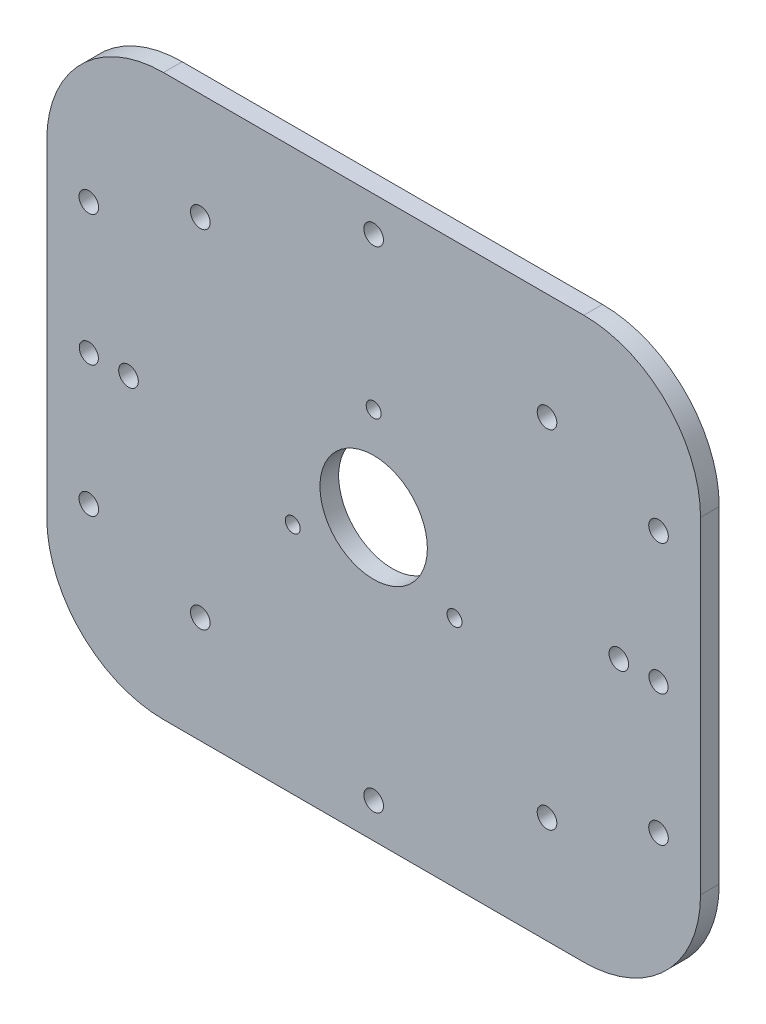
ISO-10303-21;
HEADER;
FILE_DESCRIPTION(('STEP AP214'),'2;1');
FILE_NAME('part.step','',(''),(''),'','','');
FILE_SCHEMA(('AUTOMOTIVE_DESIGN { 1 0 10303 214 1 1 1 1 }'));
ENDSEC;
DATA;
#1=APPLICATION_CONTEXT('core data for automotive mechanical design processes');
#2=APPLICATION_PROTOCOL_DEFINITION('international standard','automotive_design',2000,#1);
#3=PRODUCT_CONTEXT('',#1,'mechanical');
#4=PRODUCT('Part','Part','',(#3));
#5=PRODUCT_RELATED_PRODUCT_CATEGORY('part','',(#4));
#6=PRODUCT_DEFINITION_FORMATION('','',#4);
#7=PRODUCT_DEFINITION_CONTEXT('part definition',#1,'design');
#8=PRODUCT_DEFINITION('design','',#6,#7);
#9=PRODUCT_DEFINITION_SHAPE('','',#8);
#10=(LENGTH_UNIT() NAMED_UNIT(*) SI_UNIT(.MILLI.,.METRE.));
#11=(NAMED_UNIT(*) PLANE_ANGLE_UNIT() SI_UNIT($,.RADIAN.));
#12=(NAMED_UNIT(*) SI_UNIT($,.STERADIAN.) SOLID_ANGLE_UNIT());
#13=UNCERTAINTY_MEASURE_WITH_UNIT(LENGTH_MEASURE(1.E-05),#10,'distance_accuracy_value','');
#14=(GEOMETRIC_REPRESENTATION_CONTEXT(3) GLOBAL_UNCERTAINTY_ASSIGNED_CONTEXT((#13)) GLOBAL_UNIT_ASSIGNED_CONTEXT((#10,
#11,#12)) REPRESENTATION_CONTEXT('',''));
#15=CARTESIAN_POINT('',(0.,0.,0.));
#16=DIRECTION('',(0.,0.,1.));
#17=DIRECTION('',(1.,0.,0.));
#18=AXIS2_PLACEMENT_3D('',#15,#16,#17);
#19=CARTESIAN_POINT('',(0.,0.,4.));
#20=DIRECTION('',(0.,0.,-1.));
#21=DIRECTION('',(-1.,0.,0.));
#22=AXIS2_PLACEMENT_3D('',#19,#20,#21);
#23=PLANE('',#22);
#24=CARTESIAN_POINT('',(70.,80.,4.));
#25=DIRECTION('',(0.,0.,1.));
#26=DIRECTION('',(1.,0.,0.));
#27=AXIS2_PLACEMENT_3D('',#24,#25,#26);
#28=CIRCLE('',#27,1.60000000000001);
#29=CARTESIAN_POINT('',(71.6,80.,4.));
#30=VERTEX_POINT('',#29);
#31=EDGE_CURVE('E216',#30,#30,#28,.T.);
#32=ORIENTED_EDGE('',*,*,#31,.F.);
#33=EDGE_LOOP('',(#32));
#34=FACE_BOUND('',#33,.T.);
#35=CARTESIAN_POINT('',(87.3205080756896,50.0000000000004,4.));
#36=DIRECTION('',(0.,0.,1.));
#37=DIRECTION('',(1.,0.,0.));
#38=AXIS2_PLACEMENT_3D('',#35,#36,#37);
#39=CIRCLE('',#38,1.6);
#40=CARTESIAN_POINT('',(88.9205080756896,50.0000000000004,4.));
#41=VERTEX_POINT('',#40);
#42=EDGE_CURVE('E362',#41,#41,#39,.T.);
#43=ORIENTED_EDGE('',*,*,#42,.F.);
#44=EDGE_LOOP('',(#43));
#45=FACE_BOUND('',#44,.T.);
#46=CARTESIAN_POINT('',(52.679491924312,49.9999999999997,4.));
#47=DIRECTION('',(0.,0.,1.));
#48=DIRECTION('',(1.,0.,0.));
#49=AXIS2_PLACEMENT_3D('',#46,#47,#48);
#50=CIRCLE('',#49,1.60000000000001);
#51=CARTESIAN_POINT('',(54.279491924312,49.9999999999997,4.));
#52=VERTEX_POINT('',#51);
#53=EDGE_CURVE('E365',#52,#52,#50,.T.);
#54=ORIENTED_EDGE('',*,*,#53,.F.);
#55=EDGE_LOOP('',(#54));
#56=FACE_BOUND('',#55,.T.);
#57=CARTESIAN_POINT('',(70.,112.5,4.));
#58=DIRECTION('',(0.,0.,1.));
#59=DIRECTION('',(1.,0.,0.));
#60=AXIS2_PLACEMENT_3D('',#57,#58,#59);
#61=CIRCLE('',#60,2.1);
#62=CARTESIAN_POINT('',(72.1,112.5,4.));
#63=VERTEX_POINT('',#62);
#64=EDGE_CURVE('E192',#63,#63,#61,.T.);
#65=ORIENTED_EDGE('',*,*,#64,.F.);
#66=EDGE_LOOP('',(#65));
#67=FACE_BOUND('',#66,.T.);
#68=CARTESIAN_POINT('',(107.123106012294,97.1231060122937,4.));
#69=DIRECTION('',(0.,0.,1.));
#70=DIRECTION('',(1.,0.,0.));
#71=AXIS2_PLACEMENT_3D('',#68,#69,#70);
#72=CIRCLE('',#71,2.1);
#73=CARTESIAN_POINT('',(109.223106012294,97.1231060122937,4.));
#74=VERTEX_POINT('',#73);
#75=EDGE_CURVE('E372',#74,#74,#72,.T.);
#76=ORIENTED_EDGE('',*,*,#75,.F.);
#77=EDGE_LOOP('',(#76));
#78=FACE_BOUND('',#77,.T.);
#79=CARTESIAN_POINT('',(122.5,60.,4.));
#80=DIRECTION('',(0.,0.,1.));
#81=DIRECTION('',(1.,0.,0.));
#82=AXIS2_PLACEMENT_3D('',#79,#80,#81);
#83=CIRCLE('',#82,2.10000000000002);
#84=CARTESIAN_POINT('',(124.6,60.,4.));
#85=VERTEX_POINT('',#84);
#86=EDGE_CURVE('E375',#85,#85,#83,.T.);
#87=ORIENTED_EDGE('',*,*,#86,.F.);
#88=EDGE_LOOP('',(#87));
#89=FACE_BOUND('',#88,.T.);
#90=CARTESIAN_POINT('',(107.123106012294,22.8768939877063,4.));
#91=DIRECTION('',(0.,0.,1.));
#92=DIRECTION('',(1.,0.,0.));
#93=AXIS2_PLACEMENT_3D('',#90,#91,#92);
#94=CIRCLE('',#93,2.10000000000002);
#95=CARTESIAN_POINT('',(109.223106012294,22.8768939877063,4.));
#96=VERTEX_POINT('',#95);
#97=EDGE_CURVE('E378',#96,#96,#94,.T.);
#98=ORIENTED_EDGE('',*,*,#97,.F.);
#99=EDGE_LOOP('',(#98));
#100=FACE_BOUND('',#99,.T.);
#101=CARTESIAN_POINT('',(70.,7.50000000000001,4.));
#102=DIRECTION('',(0.,0.,1.));
#103=DIRECTION('',(1.,0.,0.));
#104=AXIS2_PLACEMENT_3D('',#101,#102,#103);
#105=CIRCLE('',#104,2.10000000000002);
#106=CARTESIAN_POINT('',(72.1,7.50000000000001,4.));
#107=VERTEX_POINT('',#106);
#108=EDGE_CURVE('E381',#107,#107,#105,.T.);
#109=ORIENTED_EDGE('',*,*,#108,.F.);
#110=EDGE_LOOP('',(#109));
#111=FACE_BOUND('',#110,.T.);
#112=CARTESIAN_POINT('',(32.8768939877063,22.8768939877062,4.));
#113=DIRECTION('',(0.,0.,1.));
#114=DIRECTION('',(1.,0.,0.));
#115=AXIS2_PLACEMENT_3D('',#112,#113,#114);
#116=CIRCLE('',#115,2.1);
#117=CARTESIAN_POINT('',(34.9768939877063,22.8768939877062,4.));
#118=VERTEX_POINT('',#117);
#119=EDGE_CURVE('E230',#118,#118,#116,.T.);
#120=ORIENTED_EDGE('',*,*,#119,.F.);
#121=EDGE_LOOP('',(#120));
#122=FACE_BOUND('',#121,.T.);
#123=CARTESIAN_POINT('',(17.5,60.,4.));
#124=DIRECTION('',(0.,0.,1.));
#125=DIRECTION('',(1.,0.,0.));
#126=AXIS2_PLACEMENT_3D('',#123,#124,#125);
#127=CIRCLE('',#126,2.10000000000001);
#128=CARTESIAN_POINT('',(19.6,60.,4.));
#129=VERTEX_POINT('',#128);
#130=EDGE_CURVE('E225',#129,#129,#127,.T.);
#131=ORIENTED_EDGE('',*,*,#130,.F.);
#132=EDGE_LOOP('',(#131));
#133=FACE_BOUND('',#132,.T.);
#134=CARTESIAN_POINT('',(32.8768939877063,97.1231060122937,4.));
#135=DIRECTION('',(0.,0.,1.));
#136=DIRECTION('',(1.,0.,0.));
#137=AXIS2_PLACEMENT_3D('',#134,#135,#136);
#138=CIRCLE('',#137,2.09999999999999);
#139=CARTESIAN_POINT('',(34.9768939877063,97.1231060122937,4.));
#140=VERTEX_POINT('',#139);
#141=EDGE_CURVE('E221',#140,#140,#138,.T.);
#142=ORIENTED_EDGE('',*,*,#141,.F.);
#143=EDGE_LOOP('',(#142));
#144=FACE_BOUND('',#143,.T.);
#145=CARTESIAN_POINT('',(131.,32.,4.));
#146=DIRECTION('',(0.,0.,1.));
#147=DIRECTION('',(-1.,0.,0.));
#148=AXIS2_PLACEMENT_3D('',#145,#146,#147);
#149=CIRCLE('',#148,2.1);
#150=CARTESIAN_POINT('',(128.9,32.,4.));
#151=VERTEX_POINT('',#150);
#152=EDGE_CURVE('E166',#151,#151,#149,.T.);
#153=ORIENTED_EDGE('',*,*,#152,.F.);
#154=EDGE_LOOP('',(#153));
#155=FACE_BOUND('',#154,.T.);
#156=CARTESIAN_POINT('',(131.,60.,4.));
#157=DIRECTION('',(0.,0.,-1.));
#158=DIRECTION('',(-1.,0.,0.));
#159=AXIS2_PLACEMENT_3D('',#156,#157,#158);
#160=CIRCLE('',#159,2.05);
#161=CARTESIAN_POINT('',(128.95,60.,4.));
#162=VERTEX_POINT('',#161);
#163=EDGE_CURVE('E159',#162,#162,#160,.T.);
#164=ORIENTED_EDGE('',*,*,#163,.T.);
#165=EDGE_LOOP('',(#164));
#166=FACE_BOUND('',#165,.T.);
#167=CARTESIAN_POINT('',(131.,88.,4.));
#168=DIRECTION('',(0.,0.,-1.));
#169=DIRECTION('',(-1.,0.,0.));
#170=AXIS2_PLACEMENT_3D('',#167,#168,#169);
#171=CIRCLE('',#170,2.1);
#172=CARTESIAN_POINT('',(128.9,88.,4.));
#173=VERTEX_POINT('',#172);
#174=EDGE_CURVE('E165',#173,#173,#171,.T.);
#175=ORIENTED_EDGE('',*,*,#174,.T.);
#176=EDGE_LOOP('',(#175));
#177=FACE_BOUND('',#176,.T.);
#178=CARTESIAN_POINT('',(9.00000000000001,32.,4.));
#179=DIRECTION('',(0.,0.,-1.));
#180=DIRECTION('',(1.,0.,0.));
#181=AXIS2_PLACEMENT_3D('',#178,#179,#180);
#182=CIRCLE('',#181,2.1);
#183=CARTESIAN_POINT('',(11.1,32.,4.));
#184=VERTEX_POINT('',#183);
#185=EDGE_CURVE('E154',#184,#184,#182,.T.);
#186=ORIENTED_EDGE('',*,*,#185,.T.);
#187=EDGE_LOOP('',(#186));
#188=FACE_BOUND('',#187,.T.);
#189=CARTESIAN_POINT('',(9.00000000000001,60.,4.));
#190=DIRECTION('',(0.,0.,1.));
#191=DIRECTION('',(1.,0.,0.));
#192=AXIS2_PLACEMENT_3D('',#189,#190,#191);
#193=CIRCLE('',#192,2.05);
#194=CARTESIAN_POINT('',(11.05,60.,4.));
#195=VERTEX_POINT('',#194);
#196=EDGE_CURVE('E146',#195,#195,#193,.T.);
#197=ORIENTED_EDGE('',*,*,#196,.F.);
#198=EDGE_LOOP('',(#197));
#199=FACE_BOUND('',#198,.T.);
#200=CARTESIAN_POINT('',(9.00000000000001,88.,4.));
#201=DIRECTION('',(0.,0.,1.));
#202=DIRECTION('',(1.,0.,0.));
#203=AXIS2_PLACEMENT_3D('',#200,#201,#202);
#204=CIRCLE('',#203,2.1);
#205=CARTESIAN_POINT('',(11.1,88.,4.));
#206=VERTEX_POINT('',#205);
#207=EDGE_CURVE('E153',#206,#206,#204,.T.);
#208=ORIENTED_EDGE('',*,*,#207,.F.);
#209=EDGE_LOOP('',(#208));
#210=FACE_BOUND('',#209,.T.);
#211=DIRECTION('',(0.,1.,0.));
#212=VECTOR('',#211,1.);
#213=CARTESIAN_POINT('',(140.,0.,4.));
#214=LINE('',#213,#212);
#215=CARTESIAN_POINT('',(140.,25.,4.));
#216=VERTEX_POINT('',#215);
#217=CARTESIAN_POINT('',(140.,95.,4.));
#218=VERTEX_POINT('',#217);
#219=EDGE_CURVE('E253',#216,#218,#214,.T.);
#220=ORIENTED_EDGE('',*,*,#219,.T.);
#221=CARTESIAN_POINT('',(115.,95.,4.));
#222=DIRECTION('',(0.,0.,-1.));
#223=DIRECTION('',(-1.,0.,0.));
#224=AXIS2_PLACEMENT_3D('',#221,#222,#223);
#225=CIRCLE('',#224,25.);
#226=CARTESIAN_POINT('',(115.,120.,4.));
#227=VERTEX_POINT('',#226);
#228=EDGE_CURVE('E180',#218,#227,#225,.F.);
#229=ORIENTED_EDGE('',*,*,#228,.T.);
#230=DIRECTION('',(-1.,0.,0.));
#231=VECTOR('',#230,1.);
#232=CARTESIAN_POINT('',(0.,120.,4.));
#233=LINE('',#232,#231);
#234=CARTESIAN_POINT('',(25.,120.,4.));
#235=VERTEX_POINT('',#234);
#236=EDGE_CURVE('E126',#227,#235,#233,.T.);
#237=ORIENTED_EDGE('',*,*,#236,.T.);
#238=CARTESIAN_POINT('',(25.,95.,4.));
#239=DIRECTION('',(0.,0.,-1.));
#240=DIRECTION('',(-1.,0.,0.));
#241=AXIS2_PLACEMENT_3D('',#238,#239,#240);
#242=CIRCLE('',#241,25.);
#243=CARTESIAN_POINT('',(0.,95.,4.));
#244=VERTEX_POINT('',#243);
#245=EDGE_CURVE('E175',#235,#244,#242,.F.);
#246=ORIENTED_EDGE('',*,*,#245,.T.);
#247=DIRECTION('',(0.,-1.,0.));
#248=VECTOR('',#247,1.);
#249=CARTESIAN_POINT('',(0.,0.,4.));
#250=LINE('',#249,#248);
#251=CARTESIAN_POINT('',(0.,25.,4.));
#252=VERTEX_POINT('',#251);
#253=EDGE_CURVE('E133',#244,#252,#250,.T.);
#254=ORIENTED_EDGE('',*,*,#253,.T.);
#255=CARTESIAN_POINT('',(25.,25.,4.));
#256=DIRECTION('',(0.,0.,-1.));
#257=DIRECTION('',(-1.,0.,0.));
#258=AXIS2_PLACEMENT_3D('',#255,#256,#257);
#259=CIRCLE('',#258,25.);
#260=CARTESIAN_POINT('',(25.,0.,4.));
#261=VERTEX_POINT('',#260);
#262=EDGE_CURVE('E62',#252,#261,#259,.F.);
#263=ORIENTED_EDGE('',*,*,#262,.T.);
#264=DIRECTION('',(1.,0.,0.));
#265=VECTOR('',#264,1.);
#266=CARTESIAN_POINT('',(0.,0.,4.));
#267=LINE('',#266,#265);
#268=CARTESIAN_POINT('',(115.,0.,4.));
#269=VERTEX_POINT('',#268);
#270=EDGE_CURVE('E136',#261,#269,#267,.T.);
#271=ORIENTED_EDGE('',*,*,#270,.T.);
#272=CARTESIAN_POINT('',(115.,25.,4.));
#273=DIRECTION('',(0.,0.,-1.));
#274=DIRECTION('',(-1.,0.,0.));
#275=AXIS2_PLACEMENT_3D('',#272,#273,#274);
#276=CIRCLE('',#275,25.);
#277=EDGE_CURVE('E178',#269,#216,#276,.F.);
#278=ORIENTED_EDGE('',*,*,#277,.T.);
#279=EDGE_LOOP('',(#220,#229,#237,#246,#254,#263,#271,#278));
#280=FACE_BOUND('',#279,.T.);
#281=CARTESIAN_POINT('',(70.,60.,4.));
#282=DIRECTION('',(0.,0.,1.));
#283=DIRECTION('',(1.,0.,0.));
#284=AXIS2_PLACEMENT_3D('',#281,#282,#283);
#285=CIRCLE('',#284,11.5);
#286=CARTESIAN_POINT('',(81.5,60.,4.));
#287=VERTEX_POINT('',#286);
#288=EDGE_CURVE('E246',#287,#287,#285,.T.);
#289=ORIENTED_EDGE('',*,*,#288,.F.);
#290=EDGE_LOOP('',(#289));
#291=FACE_BOUND('',#290,.T.);
#292=ADVANCED_FACE('F38',(#34,#45,#56,#67,#78,#89,#100,#111,#122,#133,#144,#155,#166,#177,#188,
#199,#210,#280,#291),#23,.F.);
#293=CARTESIAN_POINT('',(0.,0.,0.));
#294=DIRECTION('',(0.,0.,-1.));
#295=DIRECTION('',(-1.,0.,0.));
#296=AXIS2_PLACEMENT_3D('',#293,#294,#295);
#297=PLANE('',#296);
#298=CARTESIAN_POINT('',(70.,80.,0.));
#299=DIRECTION('',(0.,0.,-1.));
#300=DIRECTION('',(-1.,0.,0.));
#301=AXIS2_PLACEMENT_3D('',#298,#299,#300);
#302=CIRCLE('',#301,1.60000000000001);
#303=CARTESIAN_POINT('',(68.4,80.,0.));
#304=VERTEX_POINT('',#303);
#305=EDGE_CURVE('E42',#304,#304,#302,.T.);
#306=ORIENTED_EDGE('',*,*,#305,.F.);
#307=EDGE_LOOP('',(#306));
#308=FACE_BOUND('',#307,.T.);
#309=CARTESIAN_POINT('',(87.3205080756896,50.0000000000004,0.));
#310=DIRECTION('',(0.,0.,-1.));
#311=DIRECTION('',(-1.,0.,0.));
#312=AXIS2_PLACEMENT_3D('',#309,#310,#311);
#313=CIRCLE('',#312,1.6);
#314=CARTESIAN_POINT('',(85.7205080756896,50.0000000000004,0.));
#315=VERTEX_POINT('',#314);
#316=EDGE_CURVE('E215',#315,#315,#313,.T.);
#317=ORIENTED_EDGE('',*,*,#316,.F.);
#318=EDGE_LOOP('',(#317));
#319=FACE_BOUND('',#318,.T.);
#320=CARTESIAN_POINT('',(52.679491924312,49.9999999999997,0.));
#321=DIRECTION('',(0.,0.,-1.));
#322=DIRECTION('',(-1.,0.,0.));
#323=AXIS2_PLACEMENT_3D('',#320,#321,#322);
#324=CIRCLE('',#323,1.60000000000001);
#325=CARTESIAN_POINT('',(51.079491924312,49.9999999999997,0.));
#326=VERTEX_POINT('',#325);
#327=EDGE_CURVE('E213',#326,#326,#324,.T.);
#328=ORIENTED_EDGE('',*,*,#327,.F.);
#329=EDGE_LOOP('',(#328));
#330=FACE_BOUND('',#329,.T.);
#331=CARTESIAN_POINT('',(70.,112.5,0.));
#332=DIRECTION('',(0.,0.,-1.));
#333=DIRECTION('',(-1.,0.,0.));
#334=AXIS2_PLACEMENT_3D('',#331,#332,#333);
#335=CIRCLE('',#334,2.1);
#336=CARTESIAN_POINT('',(67.9,112.5,0.));
#337=VERTEX_POINT('',#336);
#338=EDGE_CURVE('E210',#337,#337,#335,.T.);
#339=ORIENTED_EDGE('',*,*,#338,.F.);
#340=EDGE_LOOP('',(#339));
#341=FACE_BOUND('',#340,.T.);
#342=CARTESIAN_POINT('',(107.123106012294,97.1231060122937,0.));
#343=DIRECTION('',(0.,0.,-1.));
#344=DIRECTION('',(-1.,0.,0.));
#345=AXIS2_PLACEMENT_3D('',#342,#343,#344);
#346=CIRCLE('',#345,2.1);
#347=CARTESIAN_POINT('',(105.023106012294,97.1231060122937,0.));
#348=VERTEX_POINT('',#347);
#349=EDGE_CURVE('E207',#348,#348,#346,.T.);
#350=ORIENTED_EDGE('',*,*,#349,.F.);
#351=EDGE_LOOP('',(#350));
#352=FACE_BOUND('',#351,.T.);
#353=CARTESIAN_POINT('',(122.5,60.,0.));
#354=DIRECTION('',(0.,0.,-1.));
#355=DIRECTION('',(-1.,0.,0.));
#356=AXIS2_PLACEMENT_3D('',#353,#354,#355);
#357=CIRCLE('',#356,2.10000000000002);
#358=CARTESIAN_POINT('',(120.4,60.,0.));
#359=VERTEX_POINT('',#358);
#360=EDGE_CURVE('E204',#359,#359,#357,.T.);
#361=ORIENTED_EDGE('',*,*,#360,.F.);
#362=EDGE_LOOP('',(#361));
#363=FACE_BOUND('',#362,.T.);
#364=CARTESIAN_POINT('',(107.123106012294,22.8768939877063,0.));
#365=DIRECTION('',(0.,0.,-1.));
#366=DIRECTION('',(-1.,0.,0.));
#367=AXIS2_PLACEMENT_3D('',#364,#365,#366);
#368=CIRCLE('',#367,2.10000000000002);
#369=CARTESIAN_POINT('',(105.023106012294,22.8768939877063,0.));
#370=VERTEX_POINT('',#369);
#371=EDGE_CURVE('E201',#370,#370,#368,.T.);
#372=ORIENTED_EDGE('',*,*,#371,.F.);
#373=EDGE_LOOP('',(#372));
#374=FACE_BOUND('',#373,.T.);
#375=CARTESIAN_POINT('',(70.,7.50000000000001,0.));
#376=DIRECTION('',(0.,0.,-1.));
#377=DIRECTION('',(-1.,0.,0.));
#378=AXIS2_PLACEMENT_3D('',#375,#376,#377);
#379=CIRCLE('',#378,2.10000000000002);
#380=CARTESIAN_POINT('',(67.9,7.50000000000001,0.));
#381=VERTEX_POINT('',#380);
#382=EDGE_CURVE('E198',#381,#381,#379,.T.);
#383=ORIENTED_EDGE('',*,*,#382,.F.);
#384=EDGE_LOOP('',(#383));
#385=FACE_BOUND('',#384,.T.);
#386=CARTESIAN_POINT('',(32.8768939877063,22.8768939877062,0.));
#387=DIRECTION('',(0.,0.,-1.));
#388=DIRECTION('',(-1.,0.,0.));
#389=AXIS2_PLACEMENT_3D('',#386,#387,#388);
#390=CIRCLE('',#389,2.1);
#391=CARTESIAN_POINT('',(30.7768939877063,22.8768939877062,0.));
#392=VERTEX_POINT('',#391);
#393=EDGE_CURVE('E195',#392,#392,#390,.T.);
#394=ORIENTED_EDGE('',*,*,#393,.F.);
#395=EDGE_LOOP('',(#394));
#396=FACE_BOUND('',#395,.T.);
#397=CARTESIAN_POINT('',(17.5,60.,0.));
#398=DIRECTION('',(0.,0.,-1.));
#399=DIRECTION('',(-1.,0.,0.));
#400=AXIS2_PLACEMENT_3D('',#397,#398,#399);
#401=CIRCLE('',#400,2.10000000000001);
#402=CARTESIAN_POINT('',(15.4,60.,0.));
#403=VERTEX_POINT('',#402);
#404=EDGE_CURVE('E191',#403,#403,#401,.T.);
#405=ORIENTED_EDGE('',*,*,#404,.F.);
#406=EDGE_LOOP('',(#405));
#407=FACE_BOUND('',#406,.T.);
#408=CARTESIAN_POINT('',(32.8768939877063,97.1231060122937,0.));
#409=DIRECTION('',(0.,0.,-1.));
#410=DIRECTION('',(-1.,0.,0.));
#411=AXIS2_PLACEMENT_3D('',#408,#409,#410);
#412=CIRCLE('',#411,2.09999999999999);
#413=CARTESIAN_POINT('',(30.7768939877063,97.1231060122937,0.));
#414=VERTEX_POINT('',#413);
#415=EDGE_CURVE('E188',#414,#414,#412,.T.);
#416=ORIENTED_EDGE('',*,*,#415,.F.);
#417=EDGE_LOOP('',(#416));
#418=FACE_BOUND('',#417,.T.);
#419=CARTESIAN_POINT('',(131.,32.,0.));
#420=DIRECTION('',(0.,0.,-1.));
#421=DIRECTION('',(-1.,0.,0.));
#422=AXIS2_PLACEMENT_3D('',#419,#420,#421);
#423=CIRCLE('',#422,2.1);
#424=CARTESIAN_POINT('',(128.9,32.,0.));
#425=VERTEX_POINT('',#424);
#426=EDGE_CURVE('E162',#425,#425,#423,.T.);
#427=ORIENTED_EDGE('',*,*,#426,.F.);
#428=EDGE_LOOP('',(#427));
#429=FACE_BOUND('',#428,.T.);
#430=CARTESIAN_POINT('',(131.,60.,0.));
#431=DIRECTION('',(0.,0.,-1.));
#432=DIRECTION('',(-1.,0.,0.));
#433=AXIS2_PLACEMENT_3D('',#430,#431,#432);
#434=CIRCLE('',#433,2.05);
#435=CARTESIAN_POINT('',(128.95,60.,0.));
#436=VERTEX_POINT('',#435);
#437=EDGE_CURVE('E158',#436,#436,#434,.F.);
#438=ORIENTED_EDGE('',*,*,#437,.T.);
#439=EDGE_LOOP('',(#438));
#440=FACE_BOUND('',#439,.T.);
#441=CARTESIAN_POINT('',(131.,88.,0.));
#442=DIRECTION('',(0.,0.,-1.));
#443=DIRECTION('',(-1.,0.,0.));
#444=AXIS2_PLACEMENT_3D('',#441,#442,#443);
#445=CIRCLE('',#444,2.1);
#446=CARTESIAN_POINT('',(128.9,88.,0.));
#447=VERTEX_POINT('',#446);
#448=EDGE_CURVE('E155',#447,#447,#445,.F.);
#449=ORIENTED_EDGE('',*,*,#448,.T.);
#450=EDGE_LOOP('',(#449));
#451=FACE_BOUND('',#450,.T.);
#452=CARTESIAN_POINT('',(9.00000000000001,32.,0.));
#453=DIRECTION('',(0.,0.,-1.));
#454=DIRECTION('',(-1.,0.,0.));
#455=AXIS2_PLACEMENT_3D('',#452,#453,#454);
#456=CIRCLE('',#455,2.1);
#457=CARTESIAN_POINT('',(6.90000000000001,32.,0.));
#458=VERTEX_POINT('',#457);
#459=EDGE_CURVE('E150',#458,#458,#456,.F.);
#460=ORIENTED_EDGE('',*,*,#459,.T.);
#461=EDGE_LOOP('',(#460));
#462=FACE_BOUND('',#461,.T.);
#463=CARTESIAN_POINT('',(9.00000000000001,60.,0.));
#464=DIRECTION('',(0.,0.,-1.));
#465=DIRECTION('',(-1.,0.,0.));
#466=AXIS2_PLACEMENT_3D('',#463,#464,#465);
#467=CIRCLE('',#466,2.05);
#468=CARTESIAN_POINT('',(6.95000000000001,60.,0.));
#469=VERTEX_POINT('',#468);
#470=EDGE_CURVE('E145',#469,#469,#467,.T.);
#471=ORIENTED_EDGE('',*,*,#470,.F.);
#472=EDGE_LOOP('',(#471));
#473=FACE_BOUND('',#472,.T.);
#474=CARTESIAN_POINT('',(9.00000000000001,88.,0.));
#475=DIRECTION('',(0.,0.,-1.));
#476=DIRECTION('',(-1.,0.,0.));
#477=AXIS2_PLACEMENT_3D('',#474,#475,#476);
#478=CIRCLE('',#477,2.1);
#479=CARTESIAN_POINT('',(6.90000000000001,88.,0.));
#480=VERTEX_POINT('',#479);
#481=EDGE_CURVE('E142',#480,#480,#478,.T.);
#482=ORIENTED_EDGE('',*,*,#481,.F.);
#483=EDGE_LOOP('',(#482));
#484=FACE_BOUND('',#483,.T.);
#485=DIRECTION('',(-1.,0.,0.));
#486=VECTOR('',#485,1.);
#487=CARTESIAN_POINT('',(0.,120.,0.));
#488=LINE('',#487,#486);
#489=CARTESIAN_POINT('',(115.,120.,0.));
#490=VERTEX_POINT('',#489);
#491=CARTESIAN_POINT('',(25.,120.,0.));
#492=VERTEX_POINT('',#491);
#493=EDGE_CURVE('E123',#490,#492,#488,.T.);
#494=ORIENTED_EDGE('',*,*,#493,.F.);
#495=CARTESIAN_POINT('',(115.,95.,0.));
#496=DIRECTION('',(0.,0.,-1.));
#497=DIRECTION('',(-1.,0.,0.));
#498=AXIS2_PLACEMENT_3D('',#495,#496,#497);
#499=CIRCLE('',#498,25.);
#500=CARTESIAN_POINT('',(140.,95.,0.));
#501=VERTEX_POINT('',#500);
#502=EDGE_CURVE('E106',#490,#501,#499,.T.);
#503=ORIENTED_EDGE('',*,*,#502,.T.);
#504=DIRECTION('',(0.,1.,0.));
#505=VECTOR('',#504,1.);
#506=CARTESIAN_POINT('',(140.,0.,0.));
#507=LINE('',#506,#505);
#508=CARTESIAN_POINT('',(140.,25.,0.));
#509=VERTEX_POINT('',#508);
#510=EDGE_CURVE('E134',#509,#501,#507,.T.);
#511=ORIENTED_EDGE('',*,*,#510,.F.);
#512=CARTESIAN_POINT('',(115.,25.,0.));
#513=DIRECTION('',(0.,0.,-1.));
#514=DIRECTION('',(-1.,0.,0.));
#515=AXIS2_PLACEMENT_3D('',#512,#513,#514);
#516=CIRCLE('',#515,25.);
#517=CARTESIAN_POINT('',(115.,0.,0.));
#518=VERTEX_POINT('',#517);
#519=EDGE_CURVE('E117',#509,#518,#516,.T.);
#520=ORIENTED_EDGE('',*,*,#519,.T.);
#521=DIRECTION('',(1.,0.,0.));
#522=VECTOR('',#521,1.);
#523=CARTESIAN_POINT('',(0.,0.,0.));
#524=LINE('',#523,#522);
#525=CARTESIAN_POINT('',(25.,0.,0.));
#526=VERTEX_POINT('',#525);
#527=EDGE_CURVE('E138',#526,#518,#524,.T.);
#528=ORIENTED_EDGE('',*,*,#527,.F.);
#529=CARTESIAN_POINT('',(25.,25.,0.));
#530=DIRECTION('',(0.,0.,-1.));
#531=DIRECTION('',(-1.,0.,0.));
#532=AXIS2_PLACEMENT_3D('',#529,#530,#531);
#533=CIRCLE('',#532,25.);
#534=CARTESIAN_POINT('',(0.,25.,0.));
#535=VERTEX_POINT('',#534);
#536=EDGE_CURVE('E169',#526,#535,#533,.T.);
#537=ORIENTED_EDGE('',*,*,#536,.T.);
#538=DIRECTION('',(0.,-1.,0.));
#539=VECTOR('',#538,1.);
#540=CARTESIAN_POINT('',(0.,0.,0.));
#541=LINE('',#540,#539);
#542=CARTESIAN_POINT('',(0.,95.,0.));
#543=VERTEX_POINT('',#542);
#544=EDGE_CURVE('E249',#543,#535,#541,.T.);
#545=ORIENTED_EDGE('',*,*,#544,.F.);
#546=CARTESIAN_POINT('',(25.,95.,0.));
#547=DIRECTION('',(0.,0.,-1.));
#548=DIRECTION('',(-1.,0.,0.));
#549=AXIS2_PLACEMENT_3D('',#546,#547,#548);
#550=CIRCLE('',#549,25.);
#551=EDGE_CURVE('E127',#543,#492,#550,.T.);
#552=ORIENTED_EDGE('',*,*,#551,.T.);
#553=EDGE_LOOP('',(#494,#503,#511,#520,#528,#537,#545,#552));
#554=FACE_BOUND('',#553,.T.);
#555=CARTESIAN_POINT('',(70.,60.,0.));
#556=DIRECTION('',(0.,0.,1.));
#557=DIRECTION('',(1.,0.,0.));
#558=AXIS2_PLACEMENT_3D('',#555,#556,#557);
#559=CIRCLE('',#558,11.5);
#560=CARTESIAN_POINT('',(81.5,60.,0.));
#561=VERTEX_POINT('',#560);
#562=EDGE_CURVE('E149',#561,#561,#559,.T.);
#563=ORIENTED_EDGE('',*,*,#562,.T.);
#564=EDGE_LOOP('',(#563));
#565=FACE_BOUND('',#564,.T.);
#566=ADVANCED_FACE('F130',(#308,#319,#330,#341,#352,#363,#374,#385,#396,#407,#418,#429,#440,
#451,#462,#473,#484,#554,#565),#297,.T.);
#567=CARTESIAN_POINT('',(0.,0.,4.));
#568=DIRECTION('',(1.,0.,0.));
#569=DIRECTION('',(0.,0.,-1.));
#570=AXIS2_PLACEMENT_3D('',#567,#568,#569);
#571=PLANE('',#570);
#572=ORIENTED_EDGE('',*,*,#544,.T.);
#573=DIRECTION('',(0.,0.,-1.));
#574=VECTOR('',#573,1.);
#575=CARTESIAN_POINT('',(0.,25.,4.));
#576=LINE('',#575,#574);
#577=EDGE_CURVE('E11',#535,#252,#576,.F.);
#578=ORIENTED_EDGE('',*,*,#577,.T.);
#579=ORIENTED_EDGE('',*,*,#253,.F.);
#580=DIRECTION('',(0.,0.,-1.));
#581=VECTOR('',#580,1.);
#582=CARTESIAN_POINT('',(0.,95.,4.));
#583=LINE('',#582,#581);
#584=EDGE_CURVE('E47',#244,#543,#583,.T.);
#585=ORIENTED_EDGE('',*,*,#584,.T.);
#586=EDGE_LOOP('',(#572,#578,#579,#585));
#587=FACE_BOUND('',#586,.T.);
#588=ADVANCED_FACE('F277',(#587),#571,.F.);
#589=CARTESIAN_POINT('',(0.,0.,4.));
#590=DIRECTION('',(0.,1.,0.));
#591=DIRECTION('',(0.,0.,1.));
#592=AXIS2_PLACEMENT_3D('',#589,#590,#591);
#593=PLANE('',#592);
#594=ORIENTED_EDGE('',*,*,#527,.T.);
#595=DIRECTION('',(0.,0.,-1.));
#596=VECTOR('',#595,1.);
#597=CARTESIAN_POINT('',(115.,0.,4.));
#598=LINE('',#597,#596);
#599=EDGE_CURVE('E55',#518,#269,#598,.F.);
#600=ORIENTED_EDGE('',*,*,#599,.T.);
#601=ORIENTED_EDGE('',*,*,#270,.F.);
#602=DIRECTION('',(0.,0.,-1.));
#603=VECTOR('',#602,1.);
#604=CARTESIAN_POINT('',(25.,0.,4.));
#605=LINE('',#604,#603);
#606=EDGE_CURVE('E182',#261,#526,#605,.T.);
#607=ORIENTED_EDGE('',*,*,#606,.T.);
#608=EDGE_LOOP('',(#594,#600,#601,#607));
#609=FACE_BOUND('',#608,.T.);
#610=ADVANCED_FACE('F259',(#609),#593,.F.);
#611=CARTESIAN_POINT('',(140.,0.,4.));
#612=DIRECTION('',(-1.,0.,0.));
#613=DIRECTION('',(0.,0.,1.));
#614=AXIS2_PLACEMENT_3D('',#611,#612,#613);
#615=PLANE('',#614);
#616=ORIENTED_EDGE('',*,*,#510,.T.);
#617=DIRECTION('',(0.,0.,-1.));
#618=VECTOR('',#617,1.);
#619=CARTESIAN_POINT('',(140.,95.,4.));
#620=LINE('',#619,#618);
#621=EDGE_CURVE('E111',#501,#218,#620,.F.);
#622=ORIENTED_EDGE('',*,*,#621,.T.);
#623=ORIENTED_EDGE('',*,*,#219,.F.);
#624=DIRECTION('',(0.,0.,-1.));
#625=VECTOR('',#624,1.);
#626=CARTESIAN_POINT('',(140.,25.,4.));
#627=LINE('',#626,#625);
#628=EDGE_CURVE('E116',#216,#509,#627,.T.);
#629=ORIENTED_EDGE('',*,*,#628,.T.);
#630=EDGE_LOOP('',(#616,#622,#623,#629));
#631=FACE_BOUND('',#630,.T.);
#632=ADVANCED_FACE('F268',(#631),#615,.F.);
#633=CARTESIAN_POINT('',(0.,120.,4.));
#634=DIRECTION('',(0.,-1.,0.));
#635=DIRECTION('',(0.,0.,-1.));
#636=AXIS2_PLACEMENT_3D('',#633,#634,#635);
#637=PLANE('',#636);
#638=ORIENTED_EDGE('',*,*,#236,.F.);
#639=DIRECTION('',(0.,0.,-1.));
#640=VECTOR('',#639,1.);
#641=CARTESIAN_POINT('',(115.,120.,4.));
#642=LINE('',#641,#640);
#643=EDGE_CURVE('E110',#227,#490,#642,.T.);
#644=ORIENTED_EDGE('',*,*,#643,.T.);
#645=ORIENTED_EDGE('',*,*,#493,.T.);
#646=DIRECTION('',(0.,0.,-1.));
#647=VECTOR('',#646,1.);
#648=CARTESIAN_POINT('',(25.,120.,4.));
#649=LINE('',#648,#647);
#650=EDGE_CURVE('E128',#492,#235,#649,.F.);
#651=ORIENTED_EDGE('',*,*,#650,.T.);
#652=EDGE_LOOP('',(#638,#644,#645,#651));
#653=FACE_BOUND('',#652,.T.);
#654=ADVANCED_FACE('F122',(#653),#637,.F.);
#655=CARTESIAN_POINT('',(70.,60.,4.));
#656=DIRECTION('',(0.,0.,-1.));
#657=DIRECTION('',(-1.,0.,0.));
#658=AXIS2_PLACEMENT_3D('',#655,#656,#657);
#659=CYLINDRICAL_SURFACE('',#658,11.5);
#660=ORIENTED_EDGE('',*,*,#288,.T.);
#661=EDGE_LOOP('',(#660));
#662=FACE_BOUND('',#661,.T.);
#663=ORIENTED_EDGE('',*,*,#562,.F.);
#664=EDGE_LOOP('',(#663));
#665=FACE_BOUND('',#664,.T.);
#666=ADVANCED_FACE('F275',(#662,#665),#659,.F.);
#667=CARTESIAN_POINT('',(9.00000000000001,88.,-6.));
#668=DIRECTION('',(0.,0.,1.));
#669=DIRECTION('',(1.,0.,0.));
#670=AXIS2_PLACEMENT_3D('',#667,#668,#669);
#671=CYLINDRICAL_SURFACE('',#670,2.1);
#672=ORIENTED_EDGE('',*,*,#481,.T.);
#673=EDGE_LOOP('',(#672));
#674=FACE_BOUND('',#673,.T.);
#675=ORIENTED_EDGE('',*,*,#207,.T.);
#676=EDGE_LOOP('',(#675));
#677=FACE_BOUND('',#676,.T.);
#678=ADVANCED_FACE('F292',(#674,#677),#671,.F.);
#679=CARTESIAN_POINT('',(9.00000000000001,60.,-6.));
#680=DIRECTION('',(0.,0.,1.));
#681=DIRECTION('',(1.,0.,0.));
#682=AXIS2_PLACEMENT_3D('',#679,#680,#681);
#683=CYLINDRICAL_SURFACE('',#682,2.05);
#684=ORIENTED_EDGE('',*,*,#470,.T.);
#685=EDGE_LOOP('',(#684));
#686=FACE_BOUND('',#685,.T.);
#687=ORIENTED_EDGE('',*,*,#196,.T.);
#688=EDGE_LOOP('',(#687));
#689=FACE_BOUND('',#688,.T.);
#690=ADVANCED_FACE('F296',(#686,#689),#683,.F.);
#691=CARTESIAN_POINT('',(9.00000000000001,32.,-6.));
#692=DIRECTION('',(0.,0.,1.));
#693=DIRECTION('',(1.,0.,0.));
#694=AXIS2_PLACEMENT_3D('',#691,#692,#693);
#695=CYLINDRICAL_SURFACE('',#694,2.1);
#696=ORIENTED_EDGE('',*,*,#459,.F.);
#697=EDGE_LOOP('',(#696));
#698=FACE_BOUND('',#697,.T.);
#699=ORIENTED_EDGE('',*,*,#185,.F.);
#700=EDGE_LOOP('',(#699));
#701=FACE_BOUND('',#700,.T.);
#702=ADVANCED_FACE('F300',(#698,#701),#695,.F.);
#703=CARTESIAN_POINT('',(131.,88.,-6.));
#704=DIRECTION('',(0.,0.,1.));
#705=DIRECTION('',(1.,0.,0.));
#706=AXIS2_PLACEMENT_3D('',#703,#704,#705);
#707=CYLINDRICAL_SURFACE('',#706,2.1);
#708=ORIENTED_EDGE('',*,*,#448,.F.);
#709=EDGE_LOOP('',(#708));
#710=FACE_BOUND('',#709,.T.);
#711=ORIENTED_EDGE('',*,*,#174,.F.);
#712=EDGE_LOOP('',(#711));
#713=FACE_BOUND('',#712,.T.);
#714=ADVANCED_FACE('F304',(#710,#713),#707,.F.);
#715=CARTESIAN_POINT('',(131.,60.,-6.));
#716=DIRECTION('',(0.,0.,1.));
#717=DIRECTION('',(1.,0.,0.));
#718=AXIS2_PLACEMENT_3D('',#715,#716,#717);
#719=CYLINDRICAL_SURFACE('',#718,2.05);
#720=ORIENTED_EDGE('',*,*,#437,.F.);
#721=EDGE_LOOP('',(#720));
#722=FACE_BOUND('',#721,.T.);
#723=ORIENTED_EDGE('',*,*,#163,.F.);
#724=EDGE_LOOP('',(#723));
#725=FACE_BOUND('',#724,.T.);
#726=ADVANCED_FACE('F308',(#722,#725),#719,.F.);
#727=CARTESIAN_POINT('',(131.,32.,-6.));
#728=DIRECTION('',(0.,0.,1.));
#729=DIRECTION('',(1.,0.,0.));
#730=AXIS2_PLACEMENT_3D('',#727,#728,#729);
#731=CYLINDRICAL_SURFACE('',#730,2.1);
#732=ORIENTED_EDGE('',*,*,#426,.T.);
#733=EDGE_LOOP('',(#732));
#734=FACE_BOUND('',#733,.T.);
#735=ORIENTED_EDGE('',*,*,#152,.T.);
#736=EDGE_LOOP('',(#735));
#737=FACE_BOUND('',#736,.T.);
#738=ADVANCED_FACE('F312',(#734,#737),#731,.F.);
#739=CARTESIAN_POINT('',(115.,95.,4.));
#740=DIRECTION('',(0.,0.,-1.));
#741=DIRECTION('',(-1.,0.,0.));
#742=AXIS2_PLACEMENT_3D('',#739,#740,#741);
#743=CYLINDRICAL_SURFACE('',#742,25.);
#744=ORIENTED_EDGE('',*,*,#228,.F.);
#745=ORIENTED_EDGE('',*,*,#621,.F.);
#746=ORIENTED_EDGE('',*,*,#502,.F.);
#747=ORIENTED_EDGE('',*,*,#643,.F.);
#748=EDGE_LOOP('',(#744,#745,#746,#747));
#749=FACE_BOUND('',#748,.T.);
#750=ADVANCED_FACE('F109',(#749),#743,.T.);
#751=CARTESIAN_POINT('',(115.,25.,4.));
#752=DIRECTION('',(0.,0.,-1.));
#753=DIRECTION('',(-1.,0.,0.));
#754=AXIS2_PLACEMENT_3D('',#751,#752,#753);
#755=CYLINDRICAL_SURFACE('',#754,25.);
#756=ORIENTED_EDGE('',*,*,#277,.F.);
#757=ORIENTED_EDGE('',*,*,#599,.F.);
#758=ORIENTED_EDGE('',*,*,#519,.F.);
#759=ORIENTED_EDGE('',*,*,#628,.F.);
#760=EDGE_LOOP('',(#756,#757,#758,#759));
#761=FACE_BOUND('',#760,.T.);
#762=ADVANCED_FACE('F263',(#761),#755,.T.);
#763=CARTESIAN_POINT('',(25.,25.,4.));
#764=DIRECTION('',(0.,0.,-1.));
#765=DIRECTION('',(-1.,0.,0.));
#766=AXIS2_PLACEMENT_3D('',#763,#764,#765);
#767=CYLINDRICAL_SURFACE('',#766,25.);
#768=ORIENTED_EDGE('',*,*,#262,.F.);
#769=ORIENTED_EDGE('',*,*,#577,.F.);
#770=ORIENTED_EDGE('',*,*,#536,.F.);
#771=ORIENTED_EDGE('',*,*,#606,.F.);
#772=EDGE_LOOP('',(#768,#769,#770,#771));
#773=FACE_BOUND('',#772,.T.);
#774=ADVANCED_FACE('F476',(#773),#767,.T.);
#775=CARTESIAN_POINT('',(25.,95.,4.));
#776=DIRECTION('',(0.,0.,-1.));
#777=DIRECTION('',(-1.,0.,0.));
#778=AXIS2_PLACEMENT_3D('',#775,#776,#777);
#779=CYLINDRICAL_SURFACE('',#778,25.);
#780=ORIENTED_EDGE('',*,*,#245,.F.);
#781=ORIENTED_EDGE('',*,*,#650,.F.);
#782=ORIENTED_EDGE('',*,*,#551,.F.);
#783=ORIENTED_EDGE('',*,*,#584,.F.);
#784=EDGE_LOOP('',(#780,#781,#782,#783));
#785=FACE_BOUND('',#784,.T.);
#786=ADVANCED_FACE('F40',(#785),#779,.T.);
#787=CARTESIAN_POINT('',(32.8768939877063,97.1231060122937,-6.));
#788=DIRECTION('',(0.,0.,1.));
#789=DIRECTION('',(1.,0.,0.));
#790=AXIS2_PLACEMENT_3D('',#787,#788,#789);
#791=CYLINDRICAL_SURFACE('',#790,2.09999999999999);
#792=ORIENTED_EDGE('',*,*,#415,.T.);
#793=EDGE_LOOP('',(#792));
#794=FACE_BOUND('',#793,.T.);
#795=ORIENTED_EDGE('',*,*,#141,.T.);
#796=EDGE_LOOP('',(#795));
#797=FACE_BOUND('',#796,.T.);
#798=ADVANCED_FACE('F317',(#794,#797),#791,.F.);
#799=CARTESIAN_POINT('',(17.5,60.,-6.));
#800=DIRECTION('',(0.,0.,1.));
#801=DIRECTION('',(1.,0.,0.));
#802=AXIS2_PLACEMENT_3D('',#799,#800,#801);
#803=CYLINDRICAL_SURFACE('',#802,2.10000000000001);
#804=ORIENTED_EDGE('',*,*,#404,.T.);
#805=EDGE_LOOP('',(#804));
#806=FACE_BOUND('',#805,.T.);
#807=ORIENTED_EDGE('',*,*,#130,.T.);
#808=EDGE_LOOP('',(#807));
#809=FACE_BOUND('',#808,.T.);
#810=ADVANCED_FACE('F320',(#806,#809),#803,.F.);
#811=CARTESIAN_POINT('',(32.8768939877063,22.8768939877062,-6.));
#812=DIRECTION('',(0.,0.,1.));
#813=DIRECTION('',(1.,0.,0.));
#814=AXIS2_PLACEMENT_3D('',#811,#812,#813);
#815=CYLINDRICAL_SURFACE('',#814,2.1);
#816=ORIENTED_EDGE('',*,*,#393,.T.);
#817=EDGE_LOOP('',(#816));
#818=FACE_BOUND('',#817,.T.);
#819=ORIENTED_EDGE('',*,*,#119,.T.);
#820=EDGE_LOOP('',(#819));
#821=FACE_BOUND('',#820,.T.);
#822=ADVANCED_FACE('F324',(#818,#821),#815,.F.);
#823=CARTESIAN_POINT('',(70.,7.50000000000001,-6.));
#824=DIRECTION('',(0.,0.,1.));
#825=DIRECTION('',(1.,0.,0.));
#826=AXIS2_PLACEMENT_3D('',#823,#824,#825);
#827=CYLINDRICAL_SURFACE('',#826,2.10000000000002);
#828=ORIENTED_EDGE('',*,*,#382,.T.);
#829=EDGE_LOOP('',(#828));
#830=FACE_BOUND('',#829,.T.);
#831=ORIENTED_EDGE('',*,*,#108,.T.);
#832=EDGE_LOOP('',(#831));
#833=FACE_BOUND('',#832,.T.);
#834=ADVANCED_FACE('F328',(#830,#833),#827,.F.);
#835=CARTESIAN_POINT('',(107.123106012294,22.8768939877063,-6.));
#836=DIRECTION('',(0.,0.,1.));
#837=DIRECTION('',(1.,0.,0.));
#838=AXIS2_PLACEMENT_3D('',#835,#836,#837);
#839=CYLINDRICAL_SURFACE('',#838,2.10000000000002);
#840=ORIENTED_EDGE('',*,*,#371,.T.);
#841=EDGE_LOOP('',(#840));
#842=FACE_BOUND('',#841,.T.);
#843=ORIENTED_EDGE('',*,*,#97,.T.);
#844=EDGE_LOOP('',(#843));
#845=FACE_BOUND('',#844,.T.);
#846=ADVANCED_FACE('F332',(#842,#845),#839,.F.);
#847=CARTESIAN_POINT('',(122.5,60.,-6.));
#848=DIRECTION('',(0.,0.,1.));
#849=DIRECTION('',(1.,0.,0.));
#850=AXIS2_PLACEMENT_3D('',#847,#848,#849);
#851=CYLINDRICAL_SURFACE('',#850,2.10000000000002);
#852=ORIENTED_EDGE('',*,*,#360,.T.);
#853=EDGE_LOOP('',(#852));
#854=FACE_BOUND('',#853,.T.);
#855=ORIENTED_EDGE('',*,*,#86,.T.);
#856=EDGE_LOOP('',(#855));
#857=FACE_BOUND('',#856,.T.);
#858=ADVANCED_FACE('F336',(#854,#857),#851,.F.);
#859=CARTESIAN_POINT('',(107.123106012294,97.1231060122937,-6.));
#860=DIRECTION('',(0.,0.,1.));
#861=DIRECTION('',(1.,0.,0.));
#862=AXIS2_PLACEMENT_3D('',#859,#860,#861);
#863=CYLINDRICAL_SURFACE('',#862,2.1);
#864=ORIENTED_EDGE('',*,*,#349,.T.);
#865=EDGE_LOOP('',(#864));
#866=FACE_BOUND('',#865,.T.);
#867=ORIENTED_EDGE('',*,*,#75,.T.);
#868=EDGE_LOOP('',(#867));
#869=FACE_BOUND('',#868,.T.);
#870=ADVANCED_FACE('F340',(#866,#869),#863,.F.);
#871=CARTESIAN_POINT('',(70.,112.5,-6.));
#872=DIRECTION('',(0.,0.,1.));
#873=DIRECTION('',(1.,0.,0.));
#874=AXIS2_PLACEMENT_3D('',#871,#872,#873);
#875=CYLINDRICAL_SURFACE('',#874,2.1);
#876=ORIENTED_EDGE('',*,*,#338,.T.);
#877=EDGE_LOOP('',(#876));
#878=FACE_BOUND('',#877,.T.);
#879=ORIENTED_EDGE('',*,*,#64,.T.);
#880=EDGE_LOOP('',(#879));
#881=FACE_BOUND('',#880,.T.);
#882=ADVANCED_FACE('F344',(#878,#881),#875,.F.);
#883=CARTESIAN_POINT('',(52.679491924312,49.9999999999997,-6.));
#884=DIRECTION('',(0.,0.,1.));
#885=DIRECTION('',(1.,0.,0.));
#886=AXIS2_PLACEMENT_3D('',#883,#884,#885);
#887=CYLINDRICAL_SURFACE('',#886,1.60000000000001);
#888=ORIENTED_EDGE('',*,*,#327,.T.);
#889=EDGE_LOOP('',(#888));
#890=FACE_BOUND('',#889,.T.);
#891=ORIENTED_EDGE('',*,*,#53,.T.);
#892=EDGE_LOOP('',(#891));
#893=FACE_BOUND('',#892,.T.);
#894=ADVANCED_FACE('F348',(#890,#893),#887,.F.);
#895=CARTESIAN_POINT('',(87.3205080756896,50.0000000000004,-6.));
#896=DIRECTION('',(0.,0.,1.));
#897=DIRECTION('',(1.,0.,0.));
#898=AXIS2_PLACEMENT_3D('',#895,#896,#897);
#899=CYLINDRICAL_SURFACE('',#898,1.6);
#900=ORIENTED_EDGE('',*,*,#316,.T.);
#901=EDGE_LOOP('',(#900));
#902=FACE_BOUND('',#901,.T.);
#903=ORIENTED_EDGE('',*,*,#42,.T.);
#904=EDGE_LOOP('',(#903));
#905=FACE_BOUND('',#904,.T.);
#906=ADVANCED_FACE('F352',(#902,#905),#899,.F.);
#907=CARTESIAN_POINT('',(70.,80.,-6.));
#908=DIRECTION('',(0.,0.,1.));
#909=DIRECTION('',(1.,0.,0.));
#910=AXIS2_PLACEMENT_3D('',#907,#908,#909);
#911=CYLINDRICAL_SURFACE('',#910,1.60000000000001);
#912=ORIENTED_EDGE('',*,*,#305,.T.);
#913=EDGE_LOOP('',(#912));
#914=FACE_BOUND('',#913,.T.);
#915=ORIENTED_EDGE('',*,*,#31,.T.);
#916=EDGE_LOOP('',(#915));
#917=FACE_BOUND('',#916,.T.);
#918=ADVANCED_FACE('F356',(#914,#917),#911,.F.);
#919=CLOSED_SHELL('',(#292,#566,#588,#610,#632,#654,#666,#678,#690,#702,#714,#726,#738,#750,
#762,#774,#786,#798,#810,#822,#834,#846,#858,#870,#882,#894,#906,#918));
#920=MANIFOLD_SOLID_BREP('B2',#919);
#921=ADVANCED_BREP_SHAPE_REPRESENTATION('',(#18,#920),#14);
#922=SHAPE_DEFINITION_REPRESENTATION(#9,#921);
ENDSEC;
END-ISO-10303-21;
